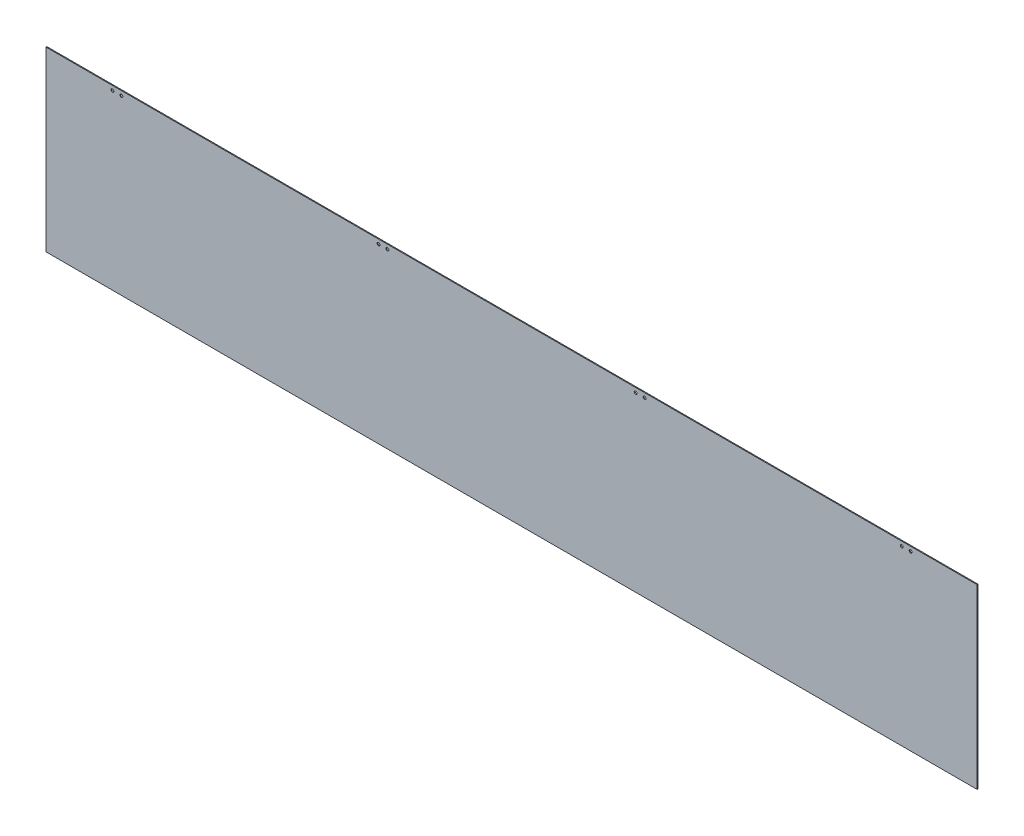
ISO-10303-21;
HEADER;
FILE_DESCRIPTION(('STEP AP214'),'2;1');
FILE_NAME('part.step','',(''),(''),'','','');
FILE_SCHEMA(('AUTOMOTIVE_DESIGN { 1 0 10303 214 1 1 1 1 }'));
ENDSEC;
DATA;
#1=APPLICATION_CONTEXT('core data for automotive mechanical design processes');
#2=APPLICATION_PROTOCOL_DEFINITION('international standard','automotive_design',2000,#1);
#3=PRODUCT_CONTEXT('',#1,'mechanical');
#4=PRODUCT('Part','Part','',(#3));
#5=PRODUCT_RELATED_PRODUCT_CATEGORY('part','',(#4));
#6=PRODUCT_DEFINITION_FORMATION('','',#4);
#7=PRODUCT_DEFINITION_CONTEXT('part definition',#1,'design');
#8=PRODUCT_DEFINITION('design','',#6,#7);
#9=PRODUCT_DEFINITION_SHAPE('','',#8);
#10=(LENGTH_UNIT() NAMED_UNIT(*) SI_UNIT(.MILLI.,.METRE.));
#11=(NAMED_UNIT(*) PLANE_ANGLE_UNIT() SI_UNIT($,.RADIAN.));
#12=(NAMED_UNIT(*) SI_UNIT($,.STERADIAN.) SOLID_ANGLE_UNIT());
#13=UNCERTAINTY_MEASURE_WITH_UNIT(LENGTH_MEASURE(1.E-05),#10,'distance_accuracy_value','');
#14=(GEOMETRIC_REPRESENTATION_CONTEXT(3) GLOBAL_UNCERTAINTY_ASSIGNED_CONTEXT((#13)) GLOBAL_UNIT_ASSIGNED_CONTEXT((#10,
#11,#12)) REPRESENTATION_CONTEXT('',''));
#15=CARTESIAN_POINT('',(0.,0.,0.));
#16=DIRECTION('',(0.,0.,1.));
#17=DIRECTION('',(1.,0.,0.));
#18=AXIS2_PLACEMENT_3D('',#15,#16,#17);
#19=CARTESIAN_POINT('',(-525.,100.,1.));
#20=DIRECTION('',(0.,1.,0.));
#21=DIRECTION('',(0.,0.,1.));
#22=AXIS2_PLACEMENT_3D('',#19,#20,#21);
#23=PLANE('',#22);
#24=DIRECTION('',(1.,0.,0.));
#25=VECTOR('',#24,1.);
#26=CARTESIAN_POINT('',(-525.,100.,0.));
#27=LINE('',#26,#25);
#28=CARTESIAN_POINT('',(-525.,100.,0.));
#29=VERTEX_POINT('',#28);
#30=CARTESIAN_POINT('',(525.,100.,0.));
#31=VERTEX_POINT('',#30);
#32=EDGE_CURVE('E114',#29,#31,#27,.T.);
#33=ORIENTED_EDGE('',*,*,#32,.F.);
#34=DIRECTION('',(0.,0.,-1.));
#35=VECTOR('',#34,1.);
#36=CARTESIAN_POINT('',(-525.,100.,1.));
#37=LINE('',#36,#35);
#38=CARTESIAN_POINT('',(-525.,100.,1.));
#39=VERTEX_POINT('',#38);
#40=EDGE_CURVE('E11',#39,#29,#37,.T.);
#41=ORIENTED_EDGE('',*,*,#40,.F.);
#42=DIRECTION('',(1.,0.,0.));
#43=VECTOR('',#42,1.);
#44=CARTESIAN_POINT('',(-525.,100.,1.));
#45=LINE('',#44,#43);
#46=CARTESIAN_POINT('',(525.,100.,1.));
#47=VERTEX_POINT('',#46);
#48=EDGE_CURVE('E105',#39,#47,#45,.T.);
#49=ORIENTED_EDGE('',*,*,#48,.T.);
#50=DIRECTION('',(0.,0.,-1.));
#51=VECTOR('',#50,1.);
#52=CARTESIAN_POINT('',(525.,100.,1.));
#53=LINE('',#52,#51);
#54=EDGE_CURVE('E46',#47,#31,#53,.T.);
#55=ORIENTED_EDGE('',*,*,#54,.T.);
#56=EDGE_LOOP('',(#33,#41,#49,#55));
#57=FACE_BOUND('',#56,.T.);
#58=ADVANCED_FACE('F43',(#57),#23,.T.);
#59=CARTESIAN_POINT('',(-525.,-100.,1.));
#60=DIRECTION('',(-1.,0.,0.));
#61=DIRECTION('',(0.,0.,1.));
#62=AXIS2_PLACEMENT_3D('',#59,#60,#61);
#63=PLANE('',#62);
#64=DIRECTION('',(0.,1.,0.));
#65=VECTOR('',#64,1.);
#66=CARTESIAN_POINT('',(-525.,-100.,0.));
#67=LINE('',#66,#65);
#68=CARTESIAN_POINT('',(-525.,-100.,0.));
#69=VERTEX_POINT('',#68);
#70=EDGE_CURVE('E108',#69,#29,#67,.T.);
#71=ORIENTED_EDGE('',*,*,#70,.F.);
#72=DIRECTION('',(0.,0.,-1.));
#73=VECTOR('',#72,1.);
#74=CARTESIAN_POINT('',(-525.,-100.,1.));
#75=LINE('',#74,#73);
#76=CARTESIAN_POINT('',(-525.,-100.,1.));
#77=VERTEX_POINT('',#76);
#78=EDGE_CURVE('E53',#77,#69,#75,.T.);
#79=ORIENTED_EDGE('',*,*,#78,.F.);
#80=DIRECTION('',(0.,1.,0.));
#81=VECTOR('',#80,1.);
#82=CARTESIAN_POINT('',(-525.,-100.,1.));
#83=LINE('',#82,#81);
#84=EDGE_CURVE('E92',#77,#39,#83,.T.);
#85=ORIENTED_EDGE('',*,*,#84,.T.);
#86=ORIENTED_EDGE('',*,*,#40,.T.);
#87=EDGE_LOOP('',(#71,#79,#85,#86));
#88=FACE_BOUND('',#87,.T.);
#89=ADVANCED_FACE('F131',(#88),#63,.T.);
#90=CARTESIAN_POINT('',(-525.,-100.,1.));
#91=DIRECTION('',(0.,1.,0.));
#92=DIRECTION('',(0.,0.,1.));
#93=AXIS2_PLACEMENT_3D('',#90,#91,#92);
#94=PLANE('',#93);
#95=DIRECTION('',(1.,0.,0.));
#96=VECTOR('',#95,1.);
#97=CARTESIAN_POINT('',(-525.,-100.,0.));
#98=LINE('',#97,#96);
#99=CARTESIAN_POINT('',(525.,-100.,0.));
#100=VERTEX_POINT('',#99);
#101=EDGE_CURVE('E98',#69,#100,#98,.T.);
#102=ORIENTED_EDGE('',*,*,#101,.T.);
#103=DIRECTION('',(0.,0.,-1.));
#104=VECTOR('',#103,1.);
#105=CARTESIAN_POINT('',(525.,-100.,1.));
#106=LINE('',#105,#104);
#107=CARTESIAN_POINT('',(525.,-100.,1.));
#108=VERTEX_POINT('',#107);
#109=EDGE_CURVE('E96',#108,#100,#106,.T.);
#110=ORIENTED_EDGE('',*,*,#109,.F.);
#111=DIRECTION('',(1.,0.,0.));
#112=VECTOR('',#111,1.);
#113=CARTESIAN_POINT('',(-525.,-100.,1.));
#114=LINE('',#113,#112);
#115=EDGE_CURVE('E89',#77,#108,#114,.T.);
#116=ORIENTED_EDGE('',*,*,#115,.F.);
#117=ORIENTED_EDGE('',*,*,#78,.T.);
#118=EDGE_LOOP('',(#102,#110,#116,#117));
#119=FACE_BOUND('',#118,.T.);
#120=ADVANCED_FACE('F97',(#119),#94,.F.);
#121=CARTESIAN_POINT('',(525.,-100.,1.));
#122=DIRECTION('',(-1.,0.,0.));
#123=DIRECTION('',(0.,0.,1.));
#124=AXIS2_PLACEMENT_3D('',#121,#122,#123);
#125=PLANE('',#124);
#126=DIRECTION('',(0.,1.,0.));
#127=VECTOR('',#126,1.);
#128=CARTESIAN_POINT('',(525.,-100.,0.));
#129=LINE('',#128,#127);
#130=EDGE_CURVE('E118',#100,#31,#129,.T.);
#131=ORIENTED_EDGE('',*,*,#130,.T.);
#132=ORIENTED_EDGE('',*,*,#54,.F.);
#133=DIRECTION('',(0.,1.,0.));
#134=VECTOR('',#133,1.);
#135=CARTESIAN_POINT('',(525.,-100.,1.));
#136=LINE('',#135,#134);
#137=EDGE_CURVE('E86',#108,#47,#136,.T.);
#138=ORIENTED_EDGE('',*,*,#137,.F.);
#139=ORIENTED_EDGE('',*,*,#109,.T.);
#140=EDGE_LOOP('',(#131,#132,#138,#139));
#141=FACE_BOUND('',#140,.T.);
#142=ADVANCED_FACE('F103',(#141),#125,.F.);
#143=CARTESIAN_POINT('',(0.,0.,1.));
#144=DIRECTION('',(0.,0.,1.));
#145=DIRECTION('',(1.,0.,0.));
#146=AXIS2_PLACEMENT_3D('',#143,#144,#145);
#147=PLANE('',#146);
#148=CARTESIAN_POINT('',(450.,95.,1.));
#149=DIRECTION('',(0.,0.,1.));
#150=DIRECTION('',(1.,0.,0.));
#151=AXIS2_PLACEMENT_3D('',#148,#149,#150);
#152=CIRCLE('',#151,1.64999999999998);
#153=CARTESIAN_POINT('',(451.65,95.,1.));
#154=VERTEX_POINT('',#153);
#155=EDGE_CURVE('E191',#154,#154,#152,.T.);
#156=ORIENTED_EDGE('',*,*,#155,.F.);
#157=EDGE_LOOP('',(#156));
#158=FACE_BOUND('',#157,.T.);
#159=CARTESIAN_POINT('',(440.,95.,1.));
#160=DIRECTION('',(0.,0.,1.));
#161=DIRECTION('',(1.,0.,0.));
#162=AXIS2_PLACEMENT_3D('',#159,#160,#161);
#163=CIRCLE('',#162,1.64999999999998);
#164=CARTESIAN_POINT('',(441.65,95.,1.));
#165=VERTEX_POINT('',#164);
#166=EDGE_CURVE('E195',#165,#165,#163,.T.);
#167=ORIENTED_EDGE('',*,*,#166,.F.);
#168=EDGE_LOOP('',(#167));
#169=FACE_BOUND('',#168,.T.);
#170=CARTESIAN_POINT('',(150.,95.,1.));
#171=DIRECTION('',(0.,0.,1.));
#172=DIRECTION('',(1.,0.,0.));
#173=AXIS2_PLACEMENT_3D('',#170,#171,#172);
#174=CIRCLE('',#173,1.64999999999998);
#175=CARTESIAN_POINT('',(151.65,95.,1.));
#176=VERTEX_POINT('',#175);
#177=EDGE_CURVE('E205',#176,#176,#174,.T.);
#178=ORIENTED_EDGE('',*,*,#177,.F.);
#179=EDGE_LOOP('',(#178));
#180=FACE_BOUND('',#179,.T.);
#181=CARTESIAN_POINT('',(140.,95.,1.));
#182=DIRECTION('',(0.,0.,1.));
#183=DIRECTION('',(1.,0.,0.));
#184=AXIS2_PLACEMENT_3D('',#181,#182,#183);
#185=CIRCLE('',#184,1.64999999999998);
#186=CARTESIAN_POINT('',(141.65,95.,1.));
#187=VERTEX_POINT('',#186);
#188=EDGE_CURVE('E213',#187,#187,#185,.T.);
#189=ORIENTED_EDGE('',*,*,#188,.F.);
#190=EDGE_LOOP('',(#189));
#191=FACE_BOUND('',#190,.T.);
#192=CARTESIAN_POINT('',(-450.,95.,1.));
#193=DIRECTION('',(0.,0.,1.));
#194=DIRECTION('',(1.,0.,0.));
#195=AXIS2_PLACEMENT_3D('',#192,#193,#194);
#196=CIRCLE('',#195,1.64999999999998);
#197=CARTESIAN_POINT('',(-448.35,95.,1.));
#198=VERTEX_POINT('',#197);
#199=EDGE_CURVE('E221',#198,#198,#196,.T.);
#200=ORIENTED_EDGE('',*,*,#199,.F.);
#201=EDGE_LOOP('',(#200));
#202=FACE_BOUND('',#201,.T.);
#203=CARTESIAN_POINT('',(-440.,95.,1.));
#204=DIRECTION('',(0.,0.,1.));
#205=DIRECTION('',(1.,0.,0.));
#206=AXIS2_PLACEMENT_3D('',#203,#204,#205);
#207=CIRCLE('',#206,1.64999999999998);
#208=CARTESIAN_POINT('',(-438.35,95.,1.));
#209=VERTEX_POINT('',#208);
#210=EDGE_CURVE('E229',#209,#209,#207,.T.);
#211=ORIENTED_EDGE('',*,*,#210,.F.);
#212=EDGE_LOOP('',(#211));
#213=FACE_BOUND('',#212,.T.);
#214=CARTESIAN_POINT('',(-150.,95.,1.));
#215=DIRECTION('',(0.,0.,1.));
#216=DIRECTION('',(1.,0.,0.));
#217=AXIS2_PLACEMENT_3D('',#214,#215,#216);
#218=CIRCLE('',#217,1.64999999999998);
#219=CARTESIAN_POINT('',(-148.35,95.,1.));
#220=VERTEX_POINT('',#219);
#221=EDGE_CURVE('E237',#220,#220,#218,.T.);
#222=ORIENTED_EDGE('',*,*,#221,.F.);
#223=EDGE_LOOP('',(#222));
#224=FACE_BOUND('',#223,.T.);
#225=CARTESIAN_POINT('',(-140.,95.,1.));
#226=DIRECTION('',(0.,0.,1.));
#227=DIRECTION('',(1.,0.,0.));
#228=AXIS2_PLACEMENT_3D('',#225,#226,#227);
#229=CIRCLE('',#228,1.64999999999998);
#230=CARTESIAN_POINT('',(-138.35,95.,1.));
#231=VERTEX_POINT('',#230);
#232=EDGE_CURVE('E245',#231,#231,#229,.T.);
#233=ORIENTED_EDGE('',*,*,#232,.F.);
#234=EDGE_LOOP('',(#233));
#235=FACE_BOUND('',#234,.T.);
#236=ORIENTED_EDGE('',*,*,#48,.F.);
#237=ORIENTED_EDGE('',*,*,#84,.F.);
#238=ORIENTED_EDGE('',*,*,#115,.T.);
#239=ORIENTED_EDGE('',*,*,#137,.T.);
#240=EDGE_LOOP('',(#236,#237,#238,#239));
#241=FACE_BOUND('',#240,.T.);
#242=ADVANCED_FACE('F91',(#158,#169,#180,#191,#202,#213,#224,#235,#241),#147,.T.);
#243=CARTESIAN_POINT('',(0.,0.,0.));
#244=DIRECTION('',(0.,0.,1.));
#245=DIRECTION('',(1.,0.,0.));
#246=AXIS2_PLACEMENT_3D('',#243,#244,#245);
#247=PLANE('',#246);
#248=CARTESIAN_POINT('',(450.,95.,0.));
#249=DIRECTION('',(0.,0.,1.));
#250=DIRECTION('',(1.,0.,0.));
#251=AXIS2_PLACEMENT_3D('',#248,#249,#250);
#252=CIRCLE('',#251,1.64999999999998);
#253=CARTESIAN_POINT('',(451.65,95.,0.));
#254=VERTEX_POINT('',#253);
#255=EDGE_CURVE('E189',#254,#254,#252,.T.);
#256=ORIENTED_EDGE('',*,*,#255,.T.);
#257=EDGE_LOOP('',(#256));
#258=FACE_BOUND('',#257,.T.);
#259=CARTESIAN_POINT('',(440.,95.,0.));
#260=DIRECTION('',(0.,0.,1.));
#261=DIRECTION('',(1.,0.,0.));
#262=AXIS2_PLACEMENT_3D('',#259,#260,#261);
#263=CIRCLE('',#262,1.64999999999998);
#264=CARTESIAN_POINT('',(441.65,95.,0.));
#265=VERTEX_POINT('',#264);
#266=EDGE_CURVE('E201',#265,#265,#263,.T.);
#267=ORIENTED_EDGE('',*,*,#266,.T.);
#268=EDGE_LOOP('',(#267));
#269=FACE_BOUND('',#268,.T.);
#270=CARTESIAN_POINT('',(150.,95.,0.));
#271=DIRECTION('',(0.,0.,1.));
#272=DIRECTION('',(1.,0.,0.));
#273=AXIS2_PLACEMENT_3D('',#270,#271,#272);
#274=CIRCLE('',#273,1.65000000000001);
#275=CARTESIAN_POINT('',(151.65,95.,0.));
#276=VERTEX_POINT('',#275);
#277=EDGE_CURVE('E209',#276,#276,#274,.T.);
#278=ORIENTED_EDGE('',*,*,#277,.T.);
#279=EDGE_LOOP('',(#278));
#280=FACE_BOUND('',#279,.T.);
#281=CARTESIAN_POINT('',(140.,95.,0.));
#282=DIRECTION('',(0.,0.,1.));
#283=DIRECTION('',(1.,0.,0.));
#284=AXIS2_PLACEMENT_3D('',#281,#282,#283);
#285=CIRCLE('',#284,1.65000000000001);
#286=CARTESIAN_POINT('',(141.65,95.,0.));
#287=VERTEX_POINT('',#286);
#288=EDGE_CURVE('E217',#287,#287,#285,.T.);
#289=ORIENTED_EDGE('',*,*,#288,.T.);
#290=EDGE_LOOP('',(#289));
#291=FACE_BOUND('',#290,.T.);
#292=CARTESIAN_POINT('',(-450.,95.,0.));
#293=DIRECTION('',(0.,0.,1.));
#294=DIRECTION('',(1.,0.,0.));
#295=AXIS2_PLACEMENT_3D('',#292,#293,#294);
#296=CIRCLE('',#295,1.64999999999998);
#297=CARTESIAN_POINT('',(-448.35,95.,0.));
#298=VERTEX_POINT('',#297);
#299=EDGE_CURVE('E225',#298,#298,#296,.T.);
#300=ORIENTED_EDGE('',*,*,#299,.T.);
#301=EDGE_LOOP('',(#300));
#302=FACE_BOUND('',#301,.T.);
#303=CARTESIAN_POINT('',(-440.,95.,0.));
#304=DIRECTION('',(0.,0.,1.));
#305=DIRECTION('',(1.,0.,0.));
#306=AXIS2_PLACEMENT_3D('',#303,#304,#305);
#307=CIRCLE('',#306,1.64999999999998);
#308=CARTESIAN_POINT('',(-438.35,95.,0.));
#309=VERTEX_POINT('',#308);
#310=EDGE_CURVE('E233',#309,#309,#307,.T.);
#311=ORIENTED_EDGE('',*,*,#310,.T.);
#312=EDGE_LOOP('',(#311));
#313=FACE_BOUND('',#312,.T.);
#314=CARTESIAN_POINT('',(-150.,95.,0.));
#315=DIRECTION('',(0.,0.,1.));
#316=DIRECTION('',(1.,0.,0.));
#317=AXIS2_PLACEMENT_3D('',#314,#315,#316);
#318=CIRCLE('',#317,1.65000000000001);
#319=CARTESIAN_POINT('',(-148.35,95.,0.));
#320=VERTEX_POINT('',#319);
#321=EDGE_CURVE('E241',#320,#320,#318,.T.);
#322=ORIENTED_EDGE('',*,*,#321,.T.);
#323=EDGE_LOOP('',(#322));
#324=FACE_BOUND('',#323,.T.);
#325=CARTESIAN_POINT('',(-140.,95.,0.));
#326=DIRECTION('',(0.,0.,1.));
#327=DIRECTION('',(1.,0.,0.));
#328=AXIS2_PLACEMENT_3D('',#325,#326,#327);
#329=CIRCLE('',#328,1.65000000000001);
#330=CARTESIAN_POINT('',(-138.35,95.,0.));
#331=VERTEX_POINT('',#330);
#332=EDGE_CURVE('E119',#331,#331,#329,.T.);
#333=ORIENTED_EDGE('',*,*,#332,.T.);
#334=EDGE_LOOP('',(#333));
#335=FACE_BOUND('',#334,.T.);
#336=ORIENTED_EDGE('',*,*,#32,.T.);
#337=ORIENTED_EDGE('',*,*,#130,.F.);
#338=ORIENTED_EDGE('',*,*,#101,.F.);
#339=ORIENTED_EDGE('',*,*,#70,.T.);
#340=EDGE_LOOP('',(#336,#337,#338,#339));
#341=FACE_BOUND('',#340,.T.);
#342=ADVANCED_FACE('F130',(#258,#269,#280,#291,#302,#313,#324,#335,#341),#247,.F.);
#343=CARTESIAN_POINT('',(-140.,95.,1.));
#344=DIRECTION('',(0.,0.,1.));
#345=DIRECTION('',(1.,0.,0.));
#346=AXIS2_PLACEMENT_3D('',#343,#344,#345);
#347=CYLINDRICAL_SURFACE('',#346,1.65);
#348=ORIENTED_EDGE('',*,*,#332,.F.);
#349=EDGE_LOOP('',(#348));
#350=FACE_BOUND('',#349,.T.);
#351=ORIENTED_EDGE('',*,*,#232,.T.);
#352=EDGE_LOOP('',(#351));
#353=FACE_BOUND('',#352,.T.);
#354=ADVANCED_FACE('F149',(#350,#353),#347,.F.);
#355=CARTESIAN_POINT('',(-150.,95.,1.));
#356=DIRECTION('',(0.,0.,1.));
#357=DIRECTION('',(1.,0.,0.));
#358=AXIS2_PLACEMENT_3D('',#355,#356,#357);
#359=CYLINDRICAL_SURFACE('',#358,1.65);
#360=ORIENTED_EDGE('',*,*,#321,.F.);
#361=EDGE_LOOP('',(#360));
#362=FACE_BOUND('',#361,.T.);
#363=ORIENTED_EDGE('',*,*,#221,.T.);
#364=EDGE_LOOP('',(#363));
#365=FACE_BOUND('',#364,.T.);
#366=ADVANCED_FACE('F156',(#362,#365),#359,.F.);
#367=CARTESIAN_POINT('',(-440.,95.,1.));
#368=DIRECTION('',(0.,0.,1.));
#369=DIRECTION('',(1.,0.,0.));
#370=AXIS2_PLACEMENT_3D('',#367,#368,#369);
#371=CYLINDRICAL_SURFACE('',#370,1.64999999999998);
#372=ORIENTED_EDGE('',*,*,#310,.F.);
#373=EDGE_LOOP('',(#372));
#374=FACE_BOUND('',#373,.T.);
#375=ORIENTED_EDGE('',*,*,#210,.T.);
#376=EDGE_LOOP('',(#375));
#377=FACE_BOUND('',#376,.T.);
#378=ADVANCED_FACE('F160',(#374,#377),#371,.F.);
#379=CARTESIAN_POINT('',(-450.,95.,1.));
#380=DIRECTION('',(0.,0.,1.));
#381=DIRECTION('',(1.,0.,0.));
#382=AXIS2_PLACEMENT_3D('',#379,#380,#381);
#383=CYLINDRICAL_SURFACE('',#382,1.64999999999998);
#384=ORIENTED_EDGE('',*,*,#299,.F.);
#385=EDGE_LOOP('',(#384));
#386=FACE_BOUND('',#385,.T.);
#387=ORIENTED_EDGE('',*,*,#199,.T.);
#388=EDGE_LOOP('',(#387));
#389=FACE_BOUND('',#388,.T.);
#390=ADVANCED_FACE('F164',(#386,#389),#383,.F.);
#391=CARTESIAN_POINT('',(140.,95.,1.));
#392=DIRECTION('',(0.,0.,1.));
#393=DIRECTION('',(1.,0.,0.));
#394=AXIS2_PLACEMENT_3D('',#391,#392,#393);
#395=CYLINDRICAL_SURFACE('',#394,1.65);
#396=ORIENTED_EDGE('',*,*,#288,.F.);
#397=EDGE_LOOP('',(#396));
#398=FACE_BOUND('',#397,.T.);
#399=ORIENTED_EDGE('',*,*,#188,.T.);
#400=EDGE_LOOP('',(#399));
#401=FACE_BOUND('',#400,.T.);
#402=ADVANCED_FACE('F168',(#398,#401),#395,.F.);
#403=CARTESIAN_POINT('',(150.,95.,1.));
#404=DIRECTION('',(0.,0.,1.));
#405=DIRECTION('',(1.,0.,0.));
#406=AXIS2_PLACEMENT_3D('',#403,#404,#405);
#407=CYLINDRICAL_SURFACE('',#406,1.65);
#408=ORIENTED_EDGE('',*,*,#277,.F.);
#409=EDGE_LOOP('',(#408));
#410=FACE_BOUND('',#409,.T.);
#411=ORIENTED_EDGE('',*,*,#177,.T.);
#412=EDGE_LOOP('',(#411));
#413=FACE_BOUND('',#412,.T.);
#414=ADVANCED_FACE('F172',(#410,#413),#407,.F.);
#415=CARTESIAN_POINT('',(440.,95.,1.));
#416=DIRECTION('',(0.,0.,1.));
#417=DIRECTION('',(1.,0.,0.));
#418=AXIS2_PLACEMENT_3D('',#415,#416,#417);
#419=CYLINDRICAL_SURFACE('',#418,1.64999999999998);
#420=ORIENTED_EDGE('',*,*,#266,.F.);
#421=EDGE_LOOP('',(#420));
#422=FACE_BOUND('',#421,.T.);
#423=ORIENTED_EDGE('',*,*,#166,.T.);
#424=EDGE_LOOP('',(#423));
#425=FACE_BOUND('',#424,.T.);
#426=ADVANCED_FACE('F176',(#422,#425),#419,.F.);
#427=CARTESIAN_POINT('',(450.,95.,1.));
#428=DIRECTION('',(0.,0.,1.));
#429=DIRECTION('',(1.,0.,0.));
#430=AXIS2_PLACEMENT_3D('',#427,#428,#429);
#431=CYLINDRICAL_SURFACE('',#430,1.64999999999998);
#432=ORIENTED_EDGE('',*,*,#255,.F.);
#433=EDGE_LOOP('',(#432));
#434=FACE_BOUND('',#433,.T.);
#435=ORIENTED_EDGE('',*,*,#155,.T.);
#436=EDGE_LOOP('',(#435));
#437=FACE_BOUND('',#436,.T.);
#438=ADVANCED_FACE('F180',(#434,#437),#431,.F.);
#439=CLOSED_SHELL('',(#58,#89,#120,#142,#242,#342,#354,#366,#378,#390,#402,#414,#426,#438));
#440=MANIFOLD_SOLID_BREP('B2',#439);
#441=ADVANCED_BREP_SHAPE_REPRESENTATION('',(#18,#440),#14);
#442=SHAPE_DEFINITION_REPRESENTATION(#9,#441);
ENDSEC;
END-ISO-10303-21;
